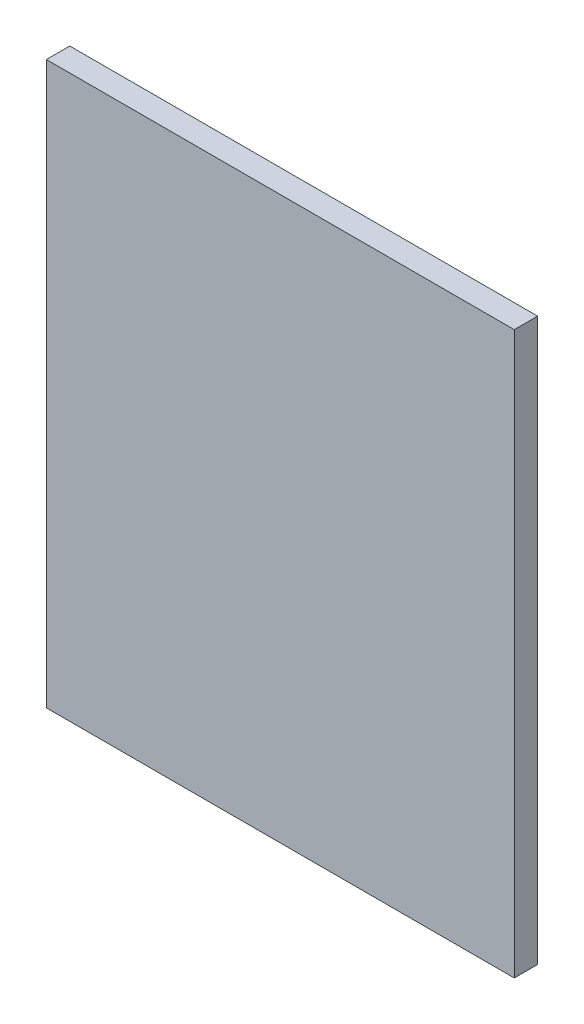
ISO-10303-21;
HEADER;
FILE_DESCRIPTION(('STEP AP214'),'2;1');
FILE_NAME('part.step','',(''),(''),'','','');
FILE_SCHEMA(('AUTOMOTIVE_DESIGN { 1 0 10303 214 1 1 1 1 }'));
ENDSEC;
DATA;
#1=APPLICATION_CONTEXT('core data for automotive mechanical design processes');
#2=APPLICATION_PROTOCOL_DEFINITION('international standard','automotive_design',2000,#1);
#3=PRODUCT_CONTEXT('',#1,'mechanical');
#4=PRODUCT('Part','Part','',(#3));
#5=PRODUCT_RELATED_PRODUCT_CATEGORY('part','',(#4));
#6=PRODUCT_DEFINITION_FORMATION('','',#4);
#7=PRODUCT_DEFINITION_CONTEXT('part definition',#1,'design');
#8=PRODUCT_DEFINITION('design','',#6,#7);
#9=PRODUCT_DEFINITION_SHAPE('','',#8);
#10=(LENGTH_UNIT() NAMED_UNIT(*) SI_UNIT(.MILLI.,.METRE.));
#11=(NAMED_UNIT(*) PLANE_ANGLE_UNIT() SI_UNIT($,.RADIAN.));
#12=(NAMED_UNIT(*) SI_UNIT($,.STERADIAN.) SOLID_ANGLE_UNIT());
#13=UNCERTAINTY_MEASURE_WITH_UNIT(LENGTH_MEASURE(1.E-05),#10,'distance_accuracy_value','');
#14=(GEOMETRIC_REPRESENTATION_CONTEXT(3) GLOBAL_UNCERTAINTY_ASSIGNED_CONTEXT((#13)) GLOBAL_UNIT_ASSIGNED_CONTEXT((#10,
#11,#12)) REPRESENTATION_CONTEXT('',''));
#15=CARTESIAN_POINT('',(0.,0.,0.));
#16=DIRECTION('',(0.,0.,1.));
#17=DIRECTION('',(1.,0.,0.));
#18=AXIS2_PLACEMENT_3D('',#15,#16,#17);
#19=CARTESIAN_POINT('',(235.616438356165,-754.109589041096,50.));
#20=DIRECTION('',(-1.,0.,0.));
#21=DIRECTION('',(0.,0.,1.));
#22=AXIS2_PLACEMENT_3D('',#19,#20,#21);
#23=PLANE('',#22);
#24=DIRECTION('',(0.,1.,0.));
#25=VECTOR('',#24,1.);
#26=CARTESIAN_POINT('',(235.616438356165,-754.109589041096,0.));
#27=LINE('',#26,#25);
#28=CARTESIAN_POINT('',(235.616438356165,-754.109589041096,0.));
#29=VERTEX_POINT('',#28);
#30=CARTESIAN_POINT('',(235.616438356165,445.890410958904,0.));
#31=VERTEX_POINT('',#30);
#32=EDGE_CURVE('E107',#29,#31,#27,.T.);
#33=ORIENTED_EDGE('',*,*,#32,.T.);
#34=DIRECTION('',(0.,0.,-1.));
#35=VECTOR('',#34,1.);
#36=CARTESIAN_POINT('',(235.616438356165,445.890410958904,50.));
#37=LINE('',#36,#35);
#38=CARTESIAN_POINT('',(235.616438356165,445.890410958904,50.));
#39=VERTEX_POINT('',#38);
#40=EDGE_CURVE('E11',#39,#31,#37,.T.);
#41=ORIENTED_EDGE('',*,*,#40,.F.);
#42=DIRECTION('',(0.,1.,0.));
#43=VECTOR('',#42,1.);
#44=CARTESIAN_POINT('',(235.616438356165,-754.109589041096,50.));
#45=LINE('',#44,#43);
#46=CARTESIAN_POINT('',(235.616438356165,-754.109589041096,50.));
#47=VERTEX_POINT('',#46);
#48=EDGE_CURVE('E91',#47,#39,#45,.T.);
#49=ORIENTED_EDGE('',*,*,#48,.F.);
#50=DIRECTION('',(0.,0.,-1.));
#51=VECTOR('',#50,1.);
#52=CARTESIAN_POINT('',(235.616438356165,-754.109589041096,50.));
#53=LINE('',#52,#51);
#54=EDGE_CURVE('E103',#47,#29,#53,.T.);
#55=ORIENTED_EDGE('',*,*,#54,.T.);
#56=EDGE_LOOP('',(#33,#41,#49,#55));
#57=FACE_BOUND('',#56,.T.);
#58=ADVANCED_FACE('F39',(#57),#23,.F.);
#59=CARTESIAN_POINT('',(235.616438356165,445.890410958904,50.));
#60=DIRECTION('',(0.,-1.,0.));
#61=DIRECTION('',(1.,0.,0.));
#62=AXIS2_PLACEMENT_3D('',#59,#60,#61);
#63=PLANE('',#62);
#64=DIRECTION('',(-1.,0.,0.));
#65=VECTOR('',#64,1.);
#66=CARTESIAN_POINT('',(235.616438356165,445.890410958904,0.));
#67=LINE('',#66,#65);
#68=CARTESIAN_POINT('',(-764.383561643835,445.890410958904,0.));
#69=VERTEX_POINT('',#68);
#70=EDGE_CURVE('E96',#31,#69,#67,.T.);
#71=ORIENTED_EDGE('',*,*,#70,.T.);
#72=DIRECTION('',(0.,0.,-1.));
#73=VECTOR('',#72,1.);
#74=CARTESIAN_POINT('',(-764.383561643835,445.890410958904,50.));
#75=LINE('',#74,#73);
#76=CARTESIAN_POINT('',(-764.383561643835,445.890410958904,50.));
#77=VERTEX_POINT('',#76);
#78=EDGE_CURVE('E48',#77,#69,#75,.T.);
#79=ORIENTED_EDGE('',*,*,#78,.F.);
#80=DIRECTION('',(-1.,0.,0.));
#81=VECTOR('',#80,1.);
#82=CARTESIAN_POINT('',(235.616438356165,445.890410958904,50.));
#83=LINE('',#82,#81);
#84=EDGE_CURVE('E86',#39,#77,#83,.T.);
#85=ORIENTED_EDGE('',*,*,#84,.F.);
#86=ORIENTED_EDGE('',*,*,#40,.T.);
#87=EDGE_LOOP('',(#71,#79,#85,#86));
#88=FACE_BOUND('',#87,.T.);
#89=ADVANCED_FACE('F95',(#88),#63,.F.);
#90=CARTESIAN_POINT('',(-764.383561643835,445.890410958904,50.));
#91=DIRECTION('',(1.,0.,0.));
#92=DIRECTION('',(0.,1.,0.));
#93=AXIS2_PLACEMENT_3D('',#90,#91,#92);
#94=PLANE('',#93);
#95=DIRECTION('',(0.,-1.,0.));
#96=VECTOR('',#95,1.);
#97=CARTESIAN_POINT('',(-764.383561643835,445.890410958904,0.));
#98=LINE('',#97,#96);
#99=CARTESIAN_POINT('',(-764.383561643835,-754.109589041096,0.));
#100=VERTEX_POINT('',#99);
#101=EDGE_CURVE('E73',#69,#100,#98,.T.);
#102=ORIENTED_EDGE('',*,*,#101,.T.);
#103=DIRECTION('',(0.,0.,-1.));
#104=VECTOR('',#103,1.);
#105=CARTESIAN_POINT('',(-764.383561643835,-754.109589041096,50.));
#106=LINE('',#105,#104);
#107=CARTESIAN_POINT('',(-764.383561643835,-754.109589041096,50.));
#108=VERTEX_POINT('',#107);
#109=EDGE_CURVE('E98',#108,#100,#106,.T.);
#110=ORIENTED_EDGE('',*,*,#109,.F.);
#111=DIRECTION('',(0.,-1.,0.));
#112=VECTOR('',#111,1.);
#113=CARTESIAN_POINT('',(-764.383561643835,445.890410958904,50.));
#114=LINE('',#113,#112);
#115=EDGE_CURVE('E89',#77,#108,#114,.T.);
#116=ORIENTED_EDGE('',*,*,#115,.F.);
#117=ORIENTED_EDGE('',*,*,#78,.T.);
#118=EDGE_LOOP('',(#102,#110,#116,#117));
#119=FACE_BOUND('',#118,.T.);
#120=ADVANCED_FACE('F99',(#119),#94,.F.);
#121=CARTESIAN_POINT('',(-764.383561643835,-754.109589041096,50.));
#122=DIRECTION('',(0.,1.,0.));
#123=DIRECTION('',(0.,0.,1.));
#124=AXIS2_PLACEMENT_3D('',#121,#122,#123);
#125=PLANE('',#124);
#126=DIRECTION('',(1.,0.,0.));
#127=VECTOR('',#126,1.);
#128=CARTESIAN_POINT('',(-764.383561643835,-754.109589041096,0.));
#129=LINE('',#128,#127);
#130=EDGE_CURVE('E79',#100,#29,#129,.T.);
#131=ORIENTED_EDGE('',*,*,#130,.T.);
#132=ORIENTED_EDGE('',*,*,#54,.F.);
#133=DIRECTION('',(1.,0.,0.));
#134=VECTOR('',#133,1.);
#135=CARTESIAN_POINT('',(-764.383561643835,-754.109589041096,50.));
#136=LINE('',#135,#134);
#137=EDGE_CURVE('E56',#108,#47,#136,.T.);
#138=ORIENTED_EDGE('',*,*,#137,.F.);
#139=ORIENTED_EDGE('',*,*,#109,.T.);
#140=EDGE_LOOP('',(#131,#132,#138,#139));
#141=FACE_BOUND('',#140,.T.);
#142=ADVANCED_FACE('F120',(#141),#125,.F.);
#143=CARTESIAN_POINT('',(0.,0.,50.));
#144=DIRECTION('',(0.,0.,1.));
#145=DIRECTION('',(1.,0.,0.));
#146=AXIS2_PLACEMENT_3D('',#143,#144,#145);
#147=PLANE('',#146);
#148=ORIENTED_EDGE('',*,*,#48,.T.);
#149=ORIENTED_EDGE('',*,*,#84,.T.);
#150=ORIENTED_EDGE('',*,*,#115,.T.);
#151=ORIENTED_EDGE('',*,*,#137,.T.);
#152=EDGE_LOOP('',(#148,#149,#150,#151));
#153=FACE_BOUND('',#152,.T.);
#154=ADVANCED_FACE('F87',(#153),#147,.T.);
#155=CARTESIAN_POINT('',(0.,0.,0.));
#156=DIRECTION('',(0.,0.,1.));
#157=DIRECTION('',(1.,0.,0.));
#158=AXIS2_PLACEMENT_3D('',#155,#156,#157);
#159=PLANE('',#158);
#160=ORIENTED_EDGE('',*,*,#32,.F.);
#161=ORIENTED_EDGE('',*,*,#130,.F.);
#162=ORIENTED_EDGE('',*,*,#101,.F.);
#163=ORIENTED_EDGE('',*,*,#70,.F.);
#164=EDGE_LOOP('',(#160,#161,#162,#163));
#165=FACE_BOUND('',#164,.T.);
#166=ADVANCED_FACE('F123',(#165),#159,.F.);
#167=CLOSED_SHELL('',(#58,#89,#120,#142,#154,#166));
#168=MANIFOLD_SOLID_BREP('B2',#167);
#169=ADVANCED_BREP_SHAPE_REPRESENTATION('',(#18,#168),#14);
#170=SHAPE_DEFINITION_REPRESENTATION(#9,#169);
ENDSEC;
END-ISO-10303-21;
